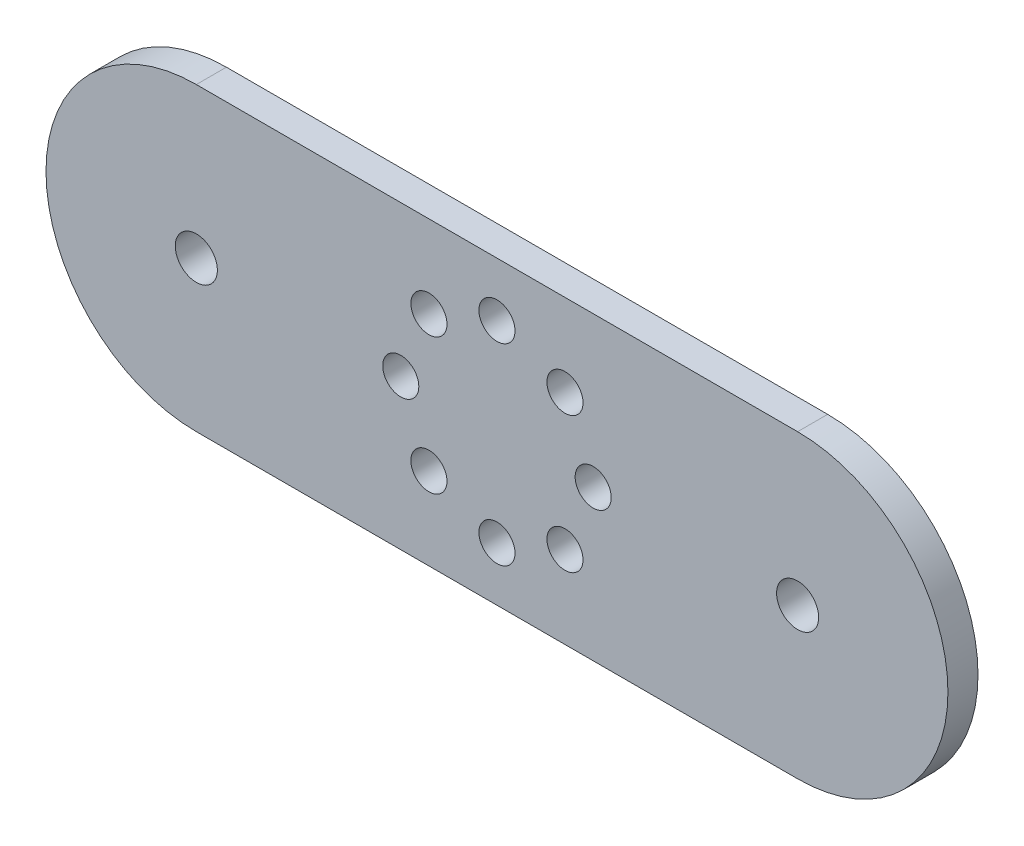
ISO-10303-21;
HEADER;
FILE_DESCRIPTION(('STEP AP214'),'2;1');
FILE_NAME('part.step','',(''),(''),'','','');
FILE_SCHEMA(('AUTOMOTIVE_DESIGN { 1 0 10303 214 1 1 1 1 }'));
ENDSEC;
DATA;
#1=APPLICATION_CONTEXT('core data for automotive mechanical design processes');
#2=APPLICATION_PROTOCOL_DEFINITION('international standard','automotive_design',2000,#1);
#3=PRODUCT_CONTEXT('',#1,'mechanical');
#4=PRODUCT('Part','Part','',(#3));
#5=PRODUCT_RELATED_PRODUCT_CATEGORY('part','',(#4));
#6=PRODUCT_DEFINITION_FORMATION('','',#4);
#7=PRODUCT_DEFINITION_CONTEXT('part definition',#1,'design');
#8=PRODUCT_DEFINITION('design','',#6,#7);
#9=PRODUCT_DEFINITION_SHAPE('','',#8);
#10=(LENGTH_UNIT() NAMED_UNIT(*) SI_UNIT(.MILLI.,.METRE.));
#11=(NAMED_UNIT(*) PLANE_ANGLE_UNIT() SI_UNIT($,.RADIAN.));
#12=(NAMED_UNIT(*) SI_UNIT($,.STERADIAN.) SOLID_ANGLE_UNIT());
#13=UNCERTAINTY_MEASURE_WITH_UNIT(LENGTH_MEASURE(1.E-05),#10,'distance_accuracy_value','');
#14=(GEOMETRIC_REPRESENTATION_CONTEXT(3) GLOBAL_UNCERTAINTY_ASSIGNED_CONTEXT((#13)) GLOBAL_UNIT_ASSIGNED_CONTEXT((#10,
#11,#12)) REPRESENTATION_CONTEXT('',''));
#15=CARTESIAN_POINT('',(0.,0.,0.));
#16=DIRECTION('',(0.,0.,1.));
#17=DIRECTION('',(1.,0.,0.));
#18=AXIS2_PLACEMENT_3D('',#15,#16,#17);
#19=CARTESIAN_POINT('',(-50.,0.,5.));
#20=DIRECTION('',(0.,0.,1.));
#21=DIRECTION('',(1.,0.,0.));
#22=AXIS2_PLACEMENT_3D('',#19,#20,#21);
#23=PLANE('',#22);
#24=CARTESIAN_POINT('',(11.3137084989849,11.3137084989846,5.));
#25=DIRECTION('',(0.,0.,1.));
#26=DIRECTION('',(1.,0.,0.));
#27=AXIS2_PLACEMENT_3D('',#24,#25,#26);
#28=CIRCLE('',#27,3.);
#29=CARTESIAN_POINT('',(14.3137084989849,11.3137084989846,5.));
#30=VERTEX_POINT('',#29);
#31=EDGE_CURVE('E157',#30,#30,#28,.T.);
#32=ORIENTED_EDGE('',*,*,#31,.F.);
#33=EDGE_LOOP('',(#32));
#34=FACE_BOUND('',#33,.T.);
#35=CARTESIAN_POINT('',(-11.3137084989847,11.3137084989849,5.));
#36=DIRECTION('',(0.,0.,1.));
#37=DIRECTION('',(1.,0.,0.));
#38=AXIS2_PLACEMENT_3D('',#35,#36,#37);
#39=CIRCLE('',#38,3.);
#40=CARTESIAN_POINT('',(-8.31370849898466,11.3137084989849,5.));
#41=VERTEX_POINT('',#40);
#42=EDGE_CURVE('E145',#41,#41,#39,.T.);
#43=ORIENTED_EDGE('',*,*,#42,.F.);
#44=EDGE_LOOP('',(#43));
#45=FACE_BOUND('',#44,.T.);
#46=CARTESIAN_POINT('',(-11.3137084989848,-11.3137084989847,5.));
#47=DIRECTION('',(0.,0.,1.));
#48=DIRECTION('',(1.,0.,0.));
#49=AXIS2_PLACEMENT_3D('',#46,#47,#48);
#50=CIRCLE('',#49,3.);
#51=CARTESIAN_POINT('',(-8.31370849898482,-11.3137084989847,5.));
#52=VERTEX_POINT('',#51);
#53=EDGE_CURVE('E133',#52,#52,#50,.T.);
#54=ORIENTED_EDGE('',*,*,#53,.F.);
#55=EDGE_LOOP('',(#54));
#56=FACE_BOUND('',#55,.T.);
#57=CARTESIAN_POINT('',(11.3137084989847,-11.3137084989848,5.));
#58=DIRECTION('',(0.,0.,1.));
#59=DIRECTION('',(1.,0.,0.));
#60=AXIS2_PLACEMENT_3D('',#57,#58,#59);
#61=CIRCLE('',#60,3.);
#62=CARTESIAN_POINT('',(14.3137084989847,-11.3137084989848,5.));
#63=VERTEX_POINT('',#62);
#64=EDGE_CURVE('E121',#63,#63,#61,.T.);
#65=ORIENTED_EDGE('',*,*,#64,.F.);
#66=EDGE_LOOP('',(#65));
#67=FACE_BOUND('',#66,.T.);
#68=CARTESIAN_POINT('',(16.,0.,5.));
#69=DIRECTION('',(0.,0.,1.));
#70=DIRECTION('',(1.,0.,0.));
#71=AXIS2_PLACEMENT_3D('',#68,#69,#70);
#72=CIRCLE('',#71,3.);
#73=CARTESIAN_POINT('',(19.,0.,5.));
#74=VERTEX_POINT('',#73);
#75=EDGE_CURVE('E100',#74,#74,#72,.T.);
#76=ORIENTED_EDGE('',*,*,#75,.F.);
#77=EDGE_LOOP('',(#76));
#78=FACE_BOUND('',#77,.T.);
#79=CARTESIAN_POINT('',(-50.,0.,5.));
#80=DIRECTION('',(0.,0.,1.));
#81=DIRECTION('',(1.,0.,0.));
#82=AXIS2_PLACEMENT_3D('',#79,#80,#81);
#83=CIRCLE('',#82,25.);
#84=CARTESIAN_POINT('',(-50.,25.,5.));
#85=VERTEX_POINT('',#84);
#86=CARTESIAN_POINT('',(-50.,-25.,5.));
#87=VERTEX_POINT('',#86);
#88=EDGE_CURVE('E85',#85,#87,#83,.T.);
#89=ORIENTED_EDGE('',*,*,#88,.T.);
#90=DIRECTION('',(1.,0.,0.));
#91=VECTOR('',#90,1.);
#92=CARTESIAN_POINT('',(-50.,-25.,5.));
#93=LINE('',#92,#91);
#94=CARTESIAN_POINT('',(50.,-25.,5.));
#95=VERTEX_POINT('',#94);
#96=EDGE_CURVE('E80',#87,#95,#93,.T.);
#97=ORIENTED_EDGE('',*,*,#96,.T.);
#98=CARTESIAN_POINT('',(50.,0.,5.));
#99=DIRECTION('',(0.,0.,1.));
#100=DIRECTION('',(1.,0.,0.));
#101=AXIS2_PLACEMENT_3D('',#98,#99,#100);
#102=CIRCLE('',#101,25.);
#103=CARTESIAN_POINT('',(50.,25.,5.));
#104=VERTEX_POINT('',#103);
#105=EDGE_CURVE('E83',#95,#104,#102,.T.);
#106=ORIENTED_EDGE('',*,*,#105,.T.);
#107=DIRECTION('',(-1.,0.,0.));
#108=VECTOR('',#107,1.);
#109=CARTESIAN_POINT('',(-50.,25.,5.));
#110=LINE('',#109,#108);
#111=EDGE_CURVE('E50',#104,#85,#110,.T.);
#112=ORIENTED_EDGE('',*,*,#111,.T.);
#113=EDGE_LOOP('',(#89,#97,#106,#112));
#114=FACE_BOUND('',#113,.T.);
#115=CARTESIAN_POINT('',(-50.,0.,5.));
#116=DIRECTION('',(0.,0.,1.));
#117=DIRECTION('',(1.,0.,0.));
#118=AXIS2_PLACEMENT_3D('',#115,#116,#117);
#119=CIRCLE('',#118,3.5);
#120=CARTESIAN_POINT('',(-46.5,0.,5.));
#121=VERTEX_POINT('',#120);
#122=EDGE_CURVE('E115',#121,#121,#119,.T.);
#123=ORIENTED_EDGE('',*,*,#122,.F.);
#124=EDGE_LOOP('',(#123));
#125=FACE_BOUND('',#124,.T.);
#126=CARTESIAN_POINT('',(0.,-16.,5.));
#127=DIRECTION('',(0.,0.,1.));
#128=DIRECTION('',(1.,0.,0.));
#129=AXIS2_PLACEMENT_3D('',#126,#127,#128);
#130=CIRCLE('',#129,3.);
#131=CARTESIAN_POINT('',(2.99999999999995,-16.,5.));
#132=VERTEX_POINT('',#131);
#133=EDGE_CURVE('E127',#132,#132,#130,.T.);
#134=ORIENTED_EDGE('',*,*,#133,.F.);
#135=EDGE_LOOP('',(#134));
#136=FACE_BOUND('',#135,.T.);
#137=CARTESIAN_POINT('',(-16.,1.1172740284298E-13,5.));
#138=DIRECTION('',(0.,0.,1.));
#139=DIRECTION('',(1.,0.,0.));
#140=AXIS2_PLACEMENT_3D('',#137,#138,#139);
#141=CIRCLE('',#140,3.);
#142=CARTESIAN_POINT('',(-13.,1.1172740284298E-13,5.));
#143=VERTEX_POINT('',#142);
#144=EDGE_CURVE('E139',#143,#143,#141,.T.);
#145=ORIENTED_EDGE('',*,*,#144,.F.);
#146=EDGE_LOOP('',(#145));
#147=FACE_BOUND('',#146,.T.);
#148=CARTESIAN_POINT('',(1.6759110426447E-13,16.,5.));
#149=DIRECTION('',(0.,0.,1.));
#150=DIRECTION('',(1.,0.,0.));
#151=AXIS2_PLACEMENT_3D('',#148,#149,#150);
#152=CIRCLE('',#151,3.);
#153=CARTESIAN_POINT('',(3.00000000000017,16.,5.));
#154=VERTEX_POINT('',#153);
#155=EDGE_CURVE('E151',#154,#154,#152,.T.);
#156=ORIENTED_EDGE('',*,*,#155,.F.);
#157=EDGE_LOOP('',(#156));
#158=FACE_BOUND('',#157,.T.);
#159=CARTESIAN_POINT('',(50.,0.,5.));
#160=DIRECTION('',(0.,0.,1.));
#161=DIRECTION('',(1.,0.,0.));
#162=AXIS2_PLACEMENT_3D('',#159,#160,#161);
#163=CIRCLE('',#162,3.5);
#164=CARTESIAN_POINT('',(53.5,0.,5.));
#165=VERTEX_POINT('',#164);
#166=EDGE_CURVE('E163',#165,#165,#163,.T.);
#167=ORIENTED_EDGE('',*,*,#166,.F.);
#168=EDGE_LOOP('',(#167));
#169=FACE_BOUND('',#168,.T.);
#170=ADVANCED_FACE('F33',(#34,#45,#56,#67,#78,#114,#125,#136,#147,#158,#169),#23,.T.);
#171=CARTESIAN_POINT('',(-50.,0.,0.));
#172=DIRECTION('',(0.,0.,1.));
#173=DIRECTION('',(1.,0.,0.));
#174=AXIS2_PLACEMENT_3D('',#171,#172,#173);
#175=PLANE('',#174);
#176=CARTESIAN_POINT('',(-50.,0.,0.));
#177=DIRECTION('',(0.,0.,1.));
#178=DIRECTION('',(1.,0.,0.));
#179=AXIS2_PLACEMENT_3D('',#176,#177,#178);
#180=CIRCLE('',#179,25.);
#181=CARTESIAN_POINT('',(-50.,25.,0.));
#182=VERTEX_POINT('',#181);
#183=CARTESIAN_POINT('',(-50.,-25.,0.));
#184=VERTEX_POINT('',#183);
#185=EDGE_CURVE('E97',#182,#184,#180,.T.);
#186=ORIENTED_EDGE('',*,*,#185,.F.);
#187=DIRECTION('',(-1.,0.,0.));
#188=VECTOR('',#187,1.);
#189=CARTESIAN_POINT('',(-50.,25.,0.));
#190=LINE('',#189,#188);
#191=CARTESIAN_POINT('',(50.,25.,0.));
#192=VERTEX_POINT('',#191);
#193=EDGE_CURVE('E73',#192,#182,#190,.T.);
#194=ORIENTED_EDGE('',*,*,#193,.F.);
#195=CARTESIAN_POINT('',(50.,0.,0.));
#196=DIRECTION('',(0.,0.,1.));
#197=DIRECTION('',(1.,0.,0.));
#198=AXIS2_PLACEMENT_3D('',#195,#196,#197);
#199=CIRCLE('',#198,25.);
#200=CARTESIAN_POINT('',(50.,-25.,0.));
#201=VERTEX_POINT('',#200);
#202=EDGE_CURVE('E67',#201,#192,#199,.T.);
#203=ORIENTED_EDGE('',*,*,#202,.F.);
#204=DIRECTION('',(1.,0.,0.));
#205=VECTOR('',#204,1.);
#206=CARTESIAN_POINT('',(-50.,-25.,0.));
#207=LINE('',#206,#205);
#208=EDGE_CURVE('E89',#184,#201,#207,.T.);
#209=ORIENTED_EDGE('',*,*,#208,.F.);
#210=EDGE_LOOP('',(#186,#194,#203,#209));
#211=FACE_BOUND('',#210,.T.);
#212=CARTESIAN_POINT('',(16.,0.,0.));
#213=DIRECTION('',(0.,0.,1.));
#214=DIRECTION('',(1.,0.,0.));
#215=AXIS2_PLACEMENT_3D('',#212,#213,#214);
#216=CIRCLE('',#215,3.);
#217=CARTESIAN_POINT('',(19.,0.,0.));
#218=VERTEX_POINT('',#217);
#219=EDGE_CURVE('E112',#218,#218,#216,.T.);
#220=ORIENTED_EDGE('',*,*,#219,.T.);
#221=EDGE_LOOP('',(#220));
#222=FACE_BOUND('',#221,.T.);
#223=CARTESIAN_POINT('',(-50.,0.,0.));
#224=DIRECTION('',(0.,0.,1.));
#225=DIRECTION('',(1.,0.,0.));
#226=AXIS2_PLACEMENT_3D('',#223,#224,#225);
#227=CIRCLE('',#226,3.5);
#228=CARTESIAN_POINT('',(-46.5,0.,0.));
#229=VERTEX_POINT('',#228);
#230=EDGE_CURVE('E118',#229,#229,#227,.T.);
#231=ORIENTED_EDGE('',*,*,#230,.T.);
#232=EDGE_LOOP('',(#231));
#233=FACE_BOUND('',#232,.T.);
#234=CARTESIAN_POINT('',(11.3137084989847,-11.3137084989848,0.));
#235=DIRECTION('',(0.,0.,1.));
#236=DIRECTION('',(1.,0.,0.));
#237=AXIS2_PLACEMENT_3D('',#234,#235,#236);
#238=CIRCLE('',#237,3.);
#239=CARTESIAN_POINT('',(14.3137084989847,-11.3137084989848,0.));
#240=VERTEX_POINT('',#239);
#241=EDGE_CURVE('E124',#240,#240,#238,.T.);
#242=ORIENTED_EDGE('',*,*,#241,.T.);
#243=EDGE_LOOP('',(#242));
#244=FACE_BOUND('',#243,.T.);
#245=CARTESIAN_POINT('',(0.,-16.,0.));
#246=DIRECTION('',(0.,0.,1.));
#247=DIRECTION('',(1.,0.,0.));
#248=AXIS2_PLACEMENT_3D('',#245,#246,#247);
#249=CIRCLE('',#248,3.);
#250=CARTESIAN_POINT('',(2.99999999999995,-16.,0.));
#251=VERTEX_POINT('',#250);
#252=EDGE_CURVE('E130',#251,#251,#249,.T.);
#253=ORIENTED_EDGE('',*,*,#252,.T.);
#254=EDGE_LOOP('',(#253));
#255=FACE_BOUND('',#254,.T.);
#256=CARTESIAN_POINT('',(-11.3137084989848,-11.3137084989847,0.));
#257=DIRECTION('',(0.,0.,1.));
#258=DIRECTION('',(1.,0.,0.));
#259=AXIS2_PLACEMENT_3D('',#256,#257,#258);
#260=CIRCLE('',#259,3.);
#261=CARTESIAN_POINT('',(-8.31370849898482,-11.3137084989847,0.));
#262=VERTEX_POINT('',#261);
#263=EDGE_CURVE('E136',#262,#262,#260,.T.);
#264=ORIENTED_EDGE('',*,*,#263,.T.);
#265=EDGE_LOOP('',(#264));
#266=FACE_BOUND('',#265,.T.);
#267=CARTESIAN_POINT('',(-16.,1.1172740284298E-13,0.));
#268=DIRECTION('',(0.,0.,1.));
#269=DIRECTION('',(1.,0.,0.));
#270=AXIS2_PLACEMENT_3D('',#267,#268,#269);
#271=CIRCLE('',#270,3.);
#272=CARTESIAN_POINT('',(-13.,1.1172740284298E-13,0.));
#273=VERTEX_POINT('',#272);
#274=EDGE_CURVE('E142',#273,#273,#271,.T.);
#275=ORIENTED_EDGE('',*,*,#274,.T.);
#276=EDGE_LOOP('',(#275));
#277=FACE_BOUND('',#276,.T.);
#278=CARTESIAN_POINT('',(-11.3137084989847,11.3137084989849,0.));
#279=DIRECTION('',(0.,0.,1.));
#280=DIRECTION('',(1.,0.,0.));
#281=AXIS2_PLACEMENT_3D('',#278,#279,#280);
#282=CIRCLE('',#281,3.);
#283=CARTESIAN_POINT('',(-8.31370849898466,11.3137084989849,0.));
#284=VERTEX_POINT('',#283);
#285=EDGE_CURVE('E148',#284,#284,#282,.T.);
#286=ORIENTED_EDGE('',*,*,#285,.T.);
#287=EDGE_LOOP('',(#286));
#288=FACE_BOUND('',#287,.T.);
#289=CARTESIAN_POINT('',(1.6759110426447E-13,16.,0.));
#290=DIRECTION('',(0.,0.,1.));
#291=DIRECTION('',(1.,0.,0.));
#292=AXIS2_PLACEMENT_3D('',#289,#290,#291);
#293=CIRCLE('',#292,3.);
#294=CARTESIAN_POINT('',(3.00000000000017,16.,0.));
#295=VERTEX_POINT('',#294);
#296=EDGE_CURVE('E154',#295,#295,#293,.T.);
#297=ORIENTED_EDGE('',*,*,#296,.T.);
#298=EDGE_LOOP('',(#297));
#299=FACE_BOUND('',#298,.T.);
#300=CARTESIAN_POINT('',(11.3137084989849,11.3137084989846,0.));
#301=DIRECTION('',(0.,0.,1.));
#302=DIRECTION('',(1.,0.,0.));
#303=AXIS2_PLACEMENT_3D('',#300,#301,#302);
#304=CIRCLE('',#303,3.);
#305=CARTESIAN_POINT('',(14.3137084989849,11.3137084989846,0.));
#306=VERTEX_POINT('',#305);
#307=EDGE_CURVE('E160',#306,#306,#304,.T.);
#308=ORIENTED_EDGE('',*,*,#307,.T.);
#309=EDGE_LOOP('',(#308));
#310=FACE_BOUND('',#309,.T.);
#311=CARTESIAN_POINT('',(50.,0.,0.));
#312=DIRECTION('',(0.,0.,1.));
#313=DIRECTION('',(1.,0.,0.));
#314=AXIS2_PLACEMENT_3D('',#311,#312,#313);
#315=CIRCLE('',#314,3.5);
#316=CARTESIAN_POINT('',(53.5,0.,0.));
#317=VERTEX_POINT('',#316);
#318=EDGE_CURVE('E166',#317,#317,#315,.T.);
#319=ORIENTED_EDGE('',*,*,#318,.T.);
#320=EDGE_LOOP('',(#319));
#321=FACE_BOUND('',#320,.T.);
#322=ADVANCED_FACE('F108',(#211,#222,#233,#244,#255,#266,#277,#288,#299,#310,#321),#175,.F.);
#323=CARTESIAN_POINT('',(-50.,0.,5.));
#324=DIRECTION('',(0.,0.,-1.));
#325=DIRECTION('',(-1.,0.,0.));
#326=AXIS2_PLACEMENT_3D('',#323,#324,#325);
#327=CYLINDRICAL_SURFACE('',#326,25.);
#328=ORIENTED_EDGE('',*,*,#185,.T.);
#329=DIRECTION('',(0.,0.,-1.));
#330=VECTOR('',#329,1.);
#331=CARTESIAN_POINT('',(-50.,-25.,5.));
#332=LINE('',#331,#330);
#333=EDGE_CURVE('E11',#87,#184,#332,.T.);
#334=ORIENTED_EDGE('',*,*,#333,.F.);
#335=ORIENTED_EDGE('',*,*,#88,.F.);
#336=DIRECTION('',(0.,0.,-1.));
#337=VECTOR('',#336,1.);
#338=CARTESIAN_POINT('',(-50.,25.,5.));
#339=LINE('',#338,#337);
#340=EDGE_CURVE('E93',#85,#182,#339,.T.);
#341=ORIENTED_EDGE('',*,*,#340,.T.);
#342=EDGE_LOOP('',(#328,#334,#335,#341));
#343=FACE_BOUND('',#342,.T.);
#344=ADVANCED_FACE('F35',(#343),#327,.T.);
#345=CARTESIAN_POINT('',(-50.,-25.,5.));
#346=DIRECTION('',(0.,1.,0.));
#347=DIRECTION('',(-1.,0.,0.));
#348=AXIS2_PLACEMENT_3D('',#345,#346,#347);
#349=PLANE('',#348);
#350=ORIENTED_EDGE('',*,*,#208,.T.);
#351=DIRECTION('',(0.,0.,-1.));
#352=VECTOR('',#351,1.);
#353=CARTESIAN_POINT('',(50.,-25.,5.));
#354=LINE('',#353,#352);
#355=EDGE_CURVE('E42',#95,#201,#354,.T.);
#356=ORIENTED_EDGE('',*,*,#355,.F.);
#357=ORIENTED_EDGE('',*,*,#96,.F.);
#358=ORIENTED_EDGE('',*,*,#333,.T.);
#359=EDGE_LOOP('',(#350,#356,#357,#358));
#360=FACE_BOUND('',#359,.T.);
#361=ADVANCED_FACE('F88',(#360),#349,.F.);
#362=CARTESIAN_POINT('',(50.,0.,5.));
#363=DIRECTION('',(0.,0.,-1.));
#364=DIRECTION('',(-1.,0.,0.));
#365=AXIS2_PLACEMENT_3D('',#362,#363,#364);
#366=CYLINDRICAL_SURFACE('',#365,25.);
#367=ORIENTED_EDGE('',*,*,#202,.T.);
#368=DIRECTION('',(0.,0.,-1.));
#369=VECTOR('',#368,1.);
#370=CARTESIAN_POINT('',(50.,25.,5.));
#371=LINE('',#370,#369);
#372=EDGE_CURVE('E90',#104,#192,#371,.T.);
#373=ORIENTED_EDGE('',*,*,#372,.F.);
#374=ORIENTED_EDGE('',*,*,#105,.F.);
#375=ORIENTED_EDGE('',*,*,#355,.T.);
#376=EDGE_LOOP('',(#367,#373,#374,#375));
#377=FACE_BOUND('',#376,.T.);
#378=ADVANCED_FACE('F91',(#377),#366,.T.);
#379=CARTESIAN_POINT('',(-50.,25.,5.));
#380=DIRECTION('',(0.,-1.,0.));
#381=DIRECTION('',(1.,0.,0.));
#382=AXIS2_PLACEMENT_3D('',#379,#380,#381);
#383=PLANE('',#382);
#384=ORIENTED_EDGE('',*,*,#193,.T.);
#385=ORIENTED_EDGE('',*,*,#340,.F.);
#386=ORIENTED_EDGE('',*,*,#111,.F.);
#387=ORIENTED_EDGE('',*,*,#372,.T.);
#388=EDGE_LOOP('',(#384,#385,#386,#387));
#389=FACE_BOUND('',#388,.T.);
#390=ADVANCED_FACE('F105',(#389),#383,.F.);
#391=CARTESIAN_POINT('',(16.,0.,5.));
#392=DIRECTION('',(0.,0.,-1.));
#393=DIRECTION('',(-1.,0.,0.));
#394=AXIS2_PLACEMENT_3D('',#391,#392,#393);
#395=CYLINDRICAL_SURFACE('',#394,3.);
#396=ORIENTED_EDGE('',*,*,#75,.T.);
#397=EDGE_LOOP('',(#396));
#398=FACE_BOUND('',#397,.T.);
#399=ORIENTED_EDGE('',*,*,#219,.F.);
#400=EDGE_LOOP('',(#399));
#401=FACE_BOUND('',#400,.T.);
#402=ADVANCED_FACE('F185',(#398,#401),#395,.F.);
#403=CARTESIAN_POINT('',(-50.,0.,5.));
#404=DIRECTION('',(0.,0.,-1.));
#405=DIRECTION('',(-1.,0.,0.));
#406=AXIS2_PLACEMENT_3D('',#403,#404,#405);
#407=CYLINDRICAL_SURFACE('',#406,3.5);
#408=ORIENTED_EDGE('',*,*,#122,.T.);
#409=EDGE_LOOP('',(#408));
#410=FACE_BOUND('',#409,.T.);
#411=ORIENTED_EDGE('',*,*,#230,.F.);
#412=EDGE_LOOP('',(#411));
#413=FACE_BOUND('',#412,.T.);
#414=ADVANCED_FACE('F231',(#410,#413),#407,.F.);
#415=CARTESIAN_POINT('',(11.3137084989847,-11.3137084989848,5.));
#416=DIRECTION('',(0.,0.,-1.));
#417=DIRECTION('',(-1.,0.,0.));
#418=AXIS2_PLACEMENT_3D('',#415,#416,#417);
#419=CYLINDRICAL_SURFACE('',#418,3.);
#420=ORIENTED_EDGE('',*,*,#64,.T.);
#421=EDGE_LOOP('',(#420));
#422=FACE_BOUND('',#421,.T.);
#423=ORIENTED_EDGE('',*,*,#241,.F.);
#424=EDGE_LOOP('',(#423));
#425=FACE_BOUND('',#424,.T.);
#426=ADVANCED_FACE('F239',(#422,#425),#419,.F.);
#427=CARTESIAN_POINT('',(0.,-16.,5.));
#428=DIRECTION('',(0.,0.,-1.));
#429=DIRECTION('',(-1.,0.,0.));
#430=AXIS2_PLACEMENT_3D('',#427,#428,#429);
#431=CYLINDRICAL_SURFACE('',#430,3.);
#432=ORIENTED_EDGE('',*,*,#133,.T.);
#433=EDGE_LOOP('',(#432));
#434=FACE_BOUND('',#433,.T.);
#435=ORIENTED_EDGE('',*,*,#252,.F.);
#436=EDGE_LOOP('',(#435));
#437=FACE_BOUND('',#436,.T.);
#438=ADVANCED_FACE('F247',(#434,#437),#431,.F.);
#439=CARTESIAN_POINT('',(-11.3137084989848,-11.3137084989847,5.));
#440=DIRECTION('',(0.,0.,-1.));
#441=DIRECTION('',(-1.,0.,0.));
#442=AXIS2_PLACEMENT_3D('',#439,#440,#441);
#443=CYLINDRICAL_SURFACE('',#442,3.);
#444=ORIENTED_EDGE('',*,*,#53,.T.);
#445=EDGE_LOOP('',(#444));
#446=FACE_BOUND('',#445,.T.);
#447=ORIENTED_EDGE('',*,*,#263,.F.);
#448=EDGE_LOOP('',(#447));
#449=FACE_BOUND('',#448,.T.);
#450=ADVANCED_FACE('F256',(#446,#449),#443,.F.);
#451=CARTESIAN_POINT('',(-16.,1.1172740284298E-13,5.));
#452=DIRECTION('',(0.,0.,-1.));
#453=DIRECTION('',(-1.,0.,0.));
#454=AXIS2_PLACEMENT_3D('',#451,#452,#453);
#455=CYLINDRICAL_SURFACE('',#454,3.);
#456=ORIENTED_EDGE('',*,*,#144,.T.);
#457=EDGE_LOOP('',(#456));
#458=FACE_BOUND('',#457,.T.);
#459=ORIENTED_EDGE('',*,*,#274,.F.);
#460=EDGE_LOOP('',(#459));
#461=FACE_BOUND('',#460,.T.);
#462=ADVANCED_FACE('F265',(#458,#461),#455,.F.);
#463=CARTESIAN_POINT('',(-11.3137084989847,11.3137084989849,5.));
#464=DIRECTION('',(0.,0.,-1.));
#465=DIRECTION('',(-1.,0.,0.));
#466=AXIS2_PLACEMENT_3D('',#463,#464,#465);
#467=CYLINDRICAL_SURFACE('',#466,3.);
#468=ORIENTED_EDGE('',*,*,#42,.T.);
#469=EDGE_LOOP('',(#468));
#470=FACE_BOUND('',#469,.T.);
#471=ORIENTED_EDGE('',*,*,#285,.F.);
#472=EDGE_LOOP('',(#471));
#473=FACE_BOUND('',#472,.T.);
#474=ADVANCED_FACE('F274',(#470,#473),#467,.F.);
#475=CARTESIAN_POINT('',(1.6759110426447E-13,16.,5.));
#476=DIRECTION('',(0.,0.,-1.));
#477=DIRECTION('',(-1.,0.,0.));
#478=AXIS2_PLACEMENT_3D('',#475,#476,#477);
#479=CYLINDRICAL_SURFACE('',#478,3.);
#480=ORIENTED_EDGE('',*,*,#155,.T.);
#481=EDGE_LOOP('',(#480));
#482=FACE_BOUND('',#481,.T.);
#483=ORIENTED_EDGE('',*,*,#296,.F.);
#484=EDGE_LOOP('',(#483));
#485=FACE_BOUND('',#484,.T.);
#486=ADVANCED_FACE('F283',(#482,#485),#479,.F.);
#487=CARTESIAN_POINT('',(11.3137084989849,11.3137084989846,5.));
#488=DIRECTION('',(0.,0.,-1.));
#489=DIRECTION('',(-1.,0.,0.));
#490=AXIS2_PLACEMENT_3D('',#487,#488,#489);
#491=CYLINDRICAL_SURFACE('',#490,3.);
#492=ORIENTED_EDGE('',*,*,#31,.T.);
#493=EDGE_LOOP('',(#492));
#494=FACE_BOUND('',#493,.T.);
#495=ORIENTED_EDGE('',*,*,#307,.F.);
#496=EDGE_LOOP('',(#495));
#497=FACE_BOUND('',#496,.T.);
#498=ADVANCED_FACE('F292',(#494,#497),#491,.F.);
#499=CARTESIAN_POINT('',(50.,0.,5.));
#500=DIRECTION('',(0.,0.,-1.));
#501=DIRECTION('',(-1.,0.,0.));
#502=AXIS2_PLACEMENT_3D('',#499,#500,#501);
#503=CYLINDRICAL_SURFACE('',#502,3.5);
#504=ORIENTED_EDGE('',*,*,#166,.T.);
#505=EDGE_LOOP('',(#504));
#506=FACE_BOUND('',#505,.T.);
#507=ORIENTED_EDGE('',*,*,#318,.F.);
#508=EDGE_LOOP('',(#507));
#509=FACE_BOUND('',#508,.T.);
#510=ADVANCED_FACE('F172',(#506,#509),#503,.F.);
#511=CLOSED_SHELL('',(#170,#322,#344,#361,#378,#390,#402,#414,#426,#438,#450,#462,#474,#486,
#498,#510));
#512=MANIFOLD_SOLID_BREP('B2',#511);
#513=ADVANCED_BREP_SHAPE_REPRESENTATION('',(#18,#512),#14);
#514=SHAPE_DEFINITION_REPRESENTATION(#9,#513);
ENDSEC;
END-ISO-10303-21;
